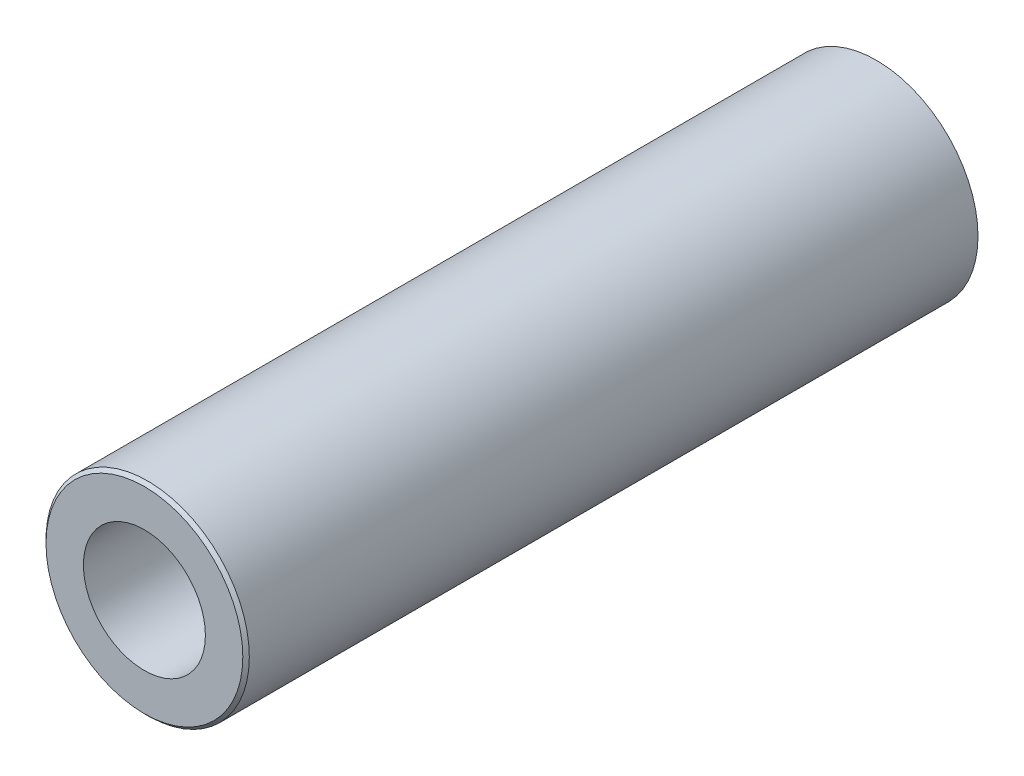
ISO-10303-21;
HEADER;
FILE_DESCRIPTION(('STEP AP214'),'2;1');
FILE_NAME('part.step','',(''),(''),'','','');
FILE_SCHEMA(('AUTOMOTIVE_DESIGN { 1 0 10303 214 1 1 1 1 }'));
ENDSEC;
DATA;
#1=APPLICATION_CONTEXT('core data for automotive mechanical design processes');
#2=APPLICATION_PROTOCOL_DEFINITION('international standard','automotive_design',2000,#1);
#3=PRODUCT_CONTEXT('',#1,'mechanical');
#4=PRODUCT('Part','Part','',(#3));
#5=PRODUCT_RELATED_PRODUCT_CATEGORY('part','',(#4));
#6=PRODUCT_DEFINITION_FORMATION('','',#4);
#7=PRODUCT_DEFINITION_CONTEXT('part definition',#1,'design');
#8=PRODUCT_DEFINITION('design','',#6,#7);
#9=PRODUCT_DEFINITION_SHAPE('','',#8);
#10=(LENGTH_UNIT() NAMED_UNIT(*) SI_UNIT(.MILLI.,.METRE.));
#11=(NAMED_UNIT(*) PLANE_ANGLE_UNIT() SI_UNIT($,.RADIAN.));
#12=(NAMED_UNIT(*) SI_UNIT($,.STERADIAN.) SOLID_ANGLE_UNIT());
#13=UNCERTAINTY_MEASURE_WITH_UNIT(LENGTH_MEASURE(1.E-05),#10,'distance_accuracy_value','');
#14=(GEOMETRIC_REPRESENTATION_CONTEXT(3) GLOBAL_UNCERTAINTY_ASSIGNED_CONTEXT((#13)) GLOBAL_UNIT_ASSIGNED_CONTEXT((#10,
#11,#12)) REPRESENTATION_CONTEXT('',''));
#15=CARTESIAN_POINT('',(0.,0.,0.));
#16=DIRECTION('',(0.,0.,1.));
#17=DIRECTION('',(1.,0.,0.));
#18=AXIS2_PLACEMENT_3D('',#15,#16,#17);
#19=CARTESIAN_POINT('',(0.,0.,57.15));
#20=DIRECTION('',(0.,0.,-1.));
#21=DIRECTION('',(-1.,0.,0.));
#22=AXIS2_PLACEMENT_3D('',#19,#20,#21);
#23=CYLINDRICAL_SURFACE('',#22,7.9375);
#24=CARTESIAN_POINT('',(0.,0.,56.896));
#25=DIRECTION('',(0.,0.,1.));
#26=DIRECTION('',(1.,0.,0.));
#27=AXIS2_PLACEMENT_3D('',#24,#25,#26);
#28=CIRCLE('',#27,7.9375);
#29=CARTESIAN_POINT('',(7.9375,0.,56.896));
#30=VERTEX_POINT('',#29);
#31=EDGE_CURVE('E10',#30,#30,#28,.F.);
#32=ORIENTED_EDGE('',*,*,#31,.T.);
#33=EDGE_LOOP('',(#32));
#34=FACE_BOUND('',#33,.T.);
#35=CARTESIAN_POINT('',(0.,0.,0.));
#36=DIRECTION('',(0.,0.,1.));
#37=DIRECTION('',(1.,0.,0.));
#38=AXIS2_PLACEMENT_3D('',#35,#36,#37);
#39=CIRCLE('',#38,7.9375);
#40=CARTESIAN_POINT('',(7.9375,0.,0.));
#41=VERTEX_POINT('',#40);
#42=EDGE_CURVE('E52',#41,#41,#39,.T.);
#43=ORIENTED_EDGE('',*,*,#42,.T.);
#44=EDGE_LOOP('',(#43));
#45=FACE_BOUND('',#44,.T.);
#46=ADVANCED_FACE('F39',(#34,#45),#23,.T.);
#47=CARTESIAN_POINT('',(0.,0.,57.15));
#48=DIRECTION('',(0.,0.,1.));
#49=DIRECTION('',(1.,0.,0.));
#50=AXIS2_PLACEMENT_3D('',#47,#48,#49);
#51=PLANE('',#50);
#52=CARTESIAN_POINT('',(0.,0.,57.15));
#53=DIRECTION('',(0.,0.,1.));
#54=DIRECTION('',(1.,0.,0.));
#55=AXIS2_PLACEMENT_3D('',#52,#53,#54);
#56=CIRCLE('',#55,4.7625);
#57=CARTESIAN_POINT('',(4.7625,0.,57.15));
#58=VERTEX_POINT('',#57);
#59=EDGE_CURVE('E63',#58,#58,#56,.T.);
#60=ORIENTED_EDGE('',*,*,#59,.F.);
#61=EDGE_LOOP('',(#60));
#62=FACE_BOUND('',#61,.T.);
#63=CARTESIAN_POINT('',(0.,0.,57.15));
#64=DIRECTION('',(0.,0.,1.));
#65=DIRECTION('',(1.,0.,0.));
#66=AXIS2_PLACEMENT_3D('',#63,#64,#65);
#67=CIRCLE('',#66,7.68350000000001);
#68=CARTESIAN_POINT('',(7.68350000000001,0.,57.15));
#69=VERTEX_POINT('',#68);
#70=EDGE_CURVE('E47',#69,#69,#67,.T.);
#71=ORIENTED_EDGE('',*,*,#70,.T.);
#72=EDGE_LOOP('',(#71));
#73=FACE_BOUND('',#72,.T.);
#74=ADVANCED_FACE('F70',(#62,#73),#51,.T.);
#75=CARTESIAN_POINT('',(0.,0.,0.));
#76=DIRECTION('',(0.,0.,1.));
#77=DIRECTION('',(1.,0.,0.));
#78=AXIS2_PLACEMENT_3D('',#75,#76,#77);
#79=PLANE('',#78);
#80=CARTESIAN_POINT('',(0.,0.,0.));
#81=DIRECTION('',(0.,0.,1.));
#82=DIRECTION('',(1.,0.,0.));
#83=AXIS2_PLACEMENT_3D('',#80,#81,#82);
#84=CIRCLE('',#83,4.76249999999999);
#85=CARTESIAN_POINT('',(4.76249999999999,0.,0.));
#86=VERTEX_POINT('',#85);
#87=EDGE_CURVE('E57',#86,#86,#84,.T.);
#88=ORIENTED_EDGE('',*,*,#87,.T.);
#89=EDGE_LOOP('',(#88));
#90=FACE_BOUND('',#89,.T.);
#91=ORIENTED_EDGE('',*,*,#42,.F.);
#92=EDGE_LOOP('',(#91));
#93=FACE_BOUND('',#92,.T.);
#94=ADVANCED_FACE('F72',(#90,#93),#79,.F.);
#95=CARTESIAN_POINT('',(0.,0.,57.15));
#96=DIRECTION('',(0.,0.,-1.));
#97=DIRECTION('',(-1.,0.,0.));
#98=AXIS2_PLACEMENT_3D('',#95,#96,#97);
#99=CONICAL_SURFACE('',#98,7.68350000000001,0.785398163397435);
#100=ORIENTED_EDGE('',*,*,#31,.F.);
#101=EDGE_LOOP('',(#100));
#102=FACE_BOUND('',#101,.T.);
#103=ORIENTED_EDGE('',*,*,#70,.F.);
#104=EDGE_LOOP('',(#103));
#105=FACE_BOUND('',#104,.T.);
#106=ADVANCED_FACE('F41',(#102,#105),#99,.T.);
#107=CARTESIAN_POINT('',(0.,0.,57.15));
#108=DIRECTION('',(0.,0.,1.));
#109=DIRECTION('',(1.,0.,0.));
#110=AXIS2_PLACEMENT_3D('',#107,#108,#109);
#111=CYLINDRICAL_SURFACE('',#110,4.76249999999999);
#112=ORIENTED_EDGE('',*,*,#87,.F.);
#113=EDGE_LOOP('',(#112));
#114=FACE_BOUND('',#113,.T.);
#115=ORIENTED_EDGE('',*,*,#59,.T.);
#116=EDGE_LOOP('',(#115));
#117=FACE_BOUND('',#116,.T.);
#118=ADVANCED_FACE('F68',(#114,#117),#111,.F.);
#119=CLOSED_SHELL('',(#46,#74,#94,#106,#118));
#120=MANIFOLD_SOLID_BREP('B2',#119);
#121=ADVANCED_BREP_SHAPE_REPRESENTATION('',(#18,#120),#14);
#122=SHAPE_DEFINITION_REPRESENTATION(#9,#121);
ENDSEC;
END-ISO-10303-21;
